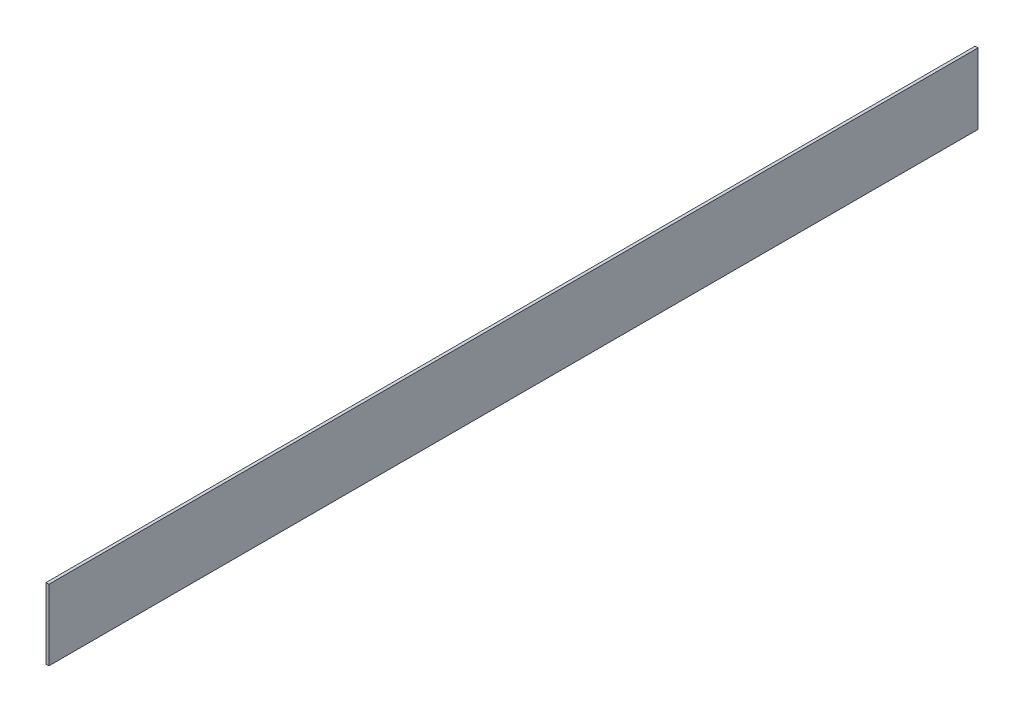
ISO-10303-21;
HEADER;
FILE_DESCRIPTION(('STEP AP214'),'2;1');
FILE_NAME('part.step','',(''),(''),'','','');
FILE_SCHEMA(('AUTOMOTIVE_DESIGN { 1 0 10303 214 1 1 1 1 }'));
ENDSEC;
DATA;
#1=APPLICATION_CONTEXT('core data for automotive mechanical design processes');
#2=APPLICATION_PROTOCOL_DEFINITION('international standard','automotive_design',2000,#1);
#3=PRODUCT_CONTEXT('',#1,'mechanical');
#4=PRODUCT('Part','Part','',(#3));
#5=PRODUCT_RELATED_PRODUCT_CATEGORY('part','',(#4));
#6=PRODUCT_DEFINITION_FORMATION('','',#4);
#7=PRODUCT_DEFINITION_CONTEXT('part definition',#1,'design');
#8=PRODUCT_DEFINITION('design','',#6,#7);
#9=PRODUCT_DEFINITION_SHAPE('','',#8);
#10=(LENGTH_UNIT() NAMED_UNIT(*) SI_UNIT(.MILLI.,.METRE.));
#11=(NAMED_UNIT(*) PLANE_ANGLE_UNIT() SI_UNIT($,.RADIAN.));
#12=(NAMED_UNIT(*) SI_UNIT($,.STERADIAN.) SOLID_ANGLE_UNIT());
#13=UNCERTAINTY_MEASURE_WITH_UNIT(LENGTH_MEASURE(1.E-05),#10,'distance_accuracy_value','');
#14=(GEOMETRIC_REPRESENTATION_CONTEXT(3) GLOBAL_UNCERTAINTY_ASSIGNED_CONTEXT((#13)) GLOBAL_UNIT_ASSIGNED_CONTEXT((#10,
#11,#12)) REPRESENTATION_CONTEXT('',''));
#15=CARTESIAN_POINT('',(0.,0.,0.));
#16=DIRECTION('',(0.,0.,1.));
#17=DIRECTION('',(1.,0.,0.));
#18=AXIS2_PLACEMENT_3D('',#15,#16,#17);
#19=CARTESIAN_POINT('',(3.175,0.,0.));
#20=DIRECTION('',(0.,0.,-1.));
#21=DIRECTION('',(0.,1.,0.));
#22=AXIS2_PLACEMENT_3D('',#19,#20,#21);
#23=PLANE('',#22);
#24=DIRECTION('',(0.,-1.,0.));
#25=VECTOR('',#24,1.);
#26=CARTESIAN_POINT('',(0.,0.,0.));
#27=LINE('',#26,#25);
#28=CARTESIAN_POINT('',(0.,0.,0.));
#29=VERTEX_POINT('',#28);
#30=CARTESIAN_POINT('',(0.,-76.073,0.));
#31=VERTEX_POINT('',#30);
#32=EDGE_CURVE('E96',#29,#31,#27,.T.);
#33=ORIENTED_EDGE('',*,*,#32,.T.);
#34=DIRECTION('',(-1.,0.,0.));
#35=VECTOR('',#34,1.);
#36=CARTESIAN_POINT('',(3.175,-76.073,0.));
#37=LINE('',#36,#35);
#38=CARTESIAN_POINT('',(3.175,-76.073,0.));
#39=VERTEX_POINT('',#38);
#40=EDGE_CURVE('E11',#39,#31,#37,.T.);
#41=ORIENTED_EDGE('',*,*,#40,.F.);
#42=DIRECTION('',(0.,-1.,0.));
#43=VECTOR('',#42,1.);
#44=CARTESIAN_POINT('',(3.175,0.,0.));
#45=LINE('',#44,#43);
#46=CARTESIAN_POINT('',(3.175,0.,0.));
#47=VERTEX_POINT('',#46);
#48=EDGE_CURVE('E84',#47,#39,#45,.T.);
#49=ORIENTED_EDGE('',*,*,#48,.F.);
#50=DIRECTION('',(-1.,0.,0.));
#51=VECTOR('',#50,1.);
#52=CARTESIAN_POINT('',(3.175,0.,0.));
#53=LINE('',#52,#51);
#54=EDGE_CURVE('E92',#47,#29,#53,.T.);
#55=ORIENTED_EDGE('',*,*,#54,.T.);
#56=EDGE_LOOP('',(#33,#41,#49,#55));
#57=FACE_BOUND('',#56,.T.);
#58=ADVANCED_FACE('F33',(#57),#23,.F.);
#59=CARTESIAN_POINT('',(3.175,-76.073,0.));
#60=DIRECTION('',(0.,1.,0.));
#61=DIRECTION('',(0.,0.,1.));
#62=AXIS2_PLACEMENT_3D('',#59,#60,#61);
#63=PLANE('',#62);
#64=DIRECTION('',(0.,0.,-1.));
#65=VECTOR('',#64,1.);
#66=CARTESIAN_POINT('',(0.,-76.073,0.));
#67=LINE('',#66,#65);
#68=CARTESIAN_POINT('',(0.,-76.073,-999.999999996));
#69=VERTEX_POINT('',#68);
#70=EDGE_CURVE('E88',#31,#69,#67,.T.);
#71=ORIENTED_EDGE('',*,*,#70,.T.);
#72=DIRECTION('',(-1.,0.,0.));
#73=VECTOR('',#72,1.);
#74=CARTESIAN_POINT('',(3.175,-76.073,-999.999999996));
#75=LINE('',#74,#73);
#76=CARTESIAN_POINT('',(3.175,-76.073,-999.999999996));
#77=VERTEX_POINT('',#76);
#78=EDGE_CURVE('E41',#77,#69,#75,.T.);
#79=ORIENTED_EDGE('',*,*,#78,.F.);
#80=DIRECTION('',(0.,0.,-1.));
#81=VECTOR('',#80,1.);
#82=CARTESIAN_POINT('',(3.175,-76.073,0.));
#83=LINE('',#82,#81);
#84=EDGE_CURVE('E79',#39,#77,#83,.T.);
#85=ORIENTED_EDGE('',*,*,#84,.F.);
#86=ORIENTED_EDGE('',*,*,#40,.T.);
#87=EDGE_LOOP('',(#71,#79,#85,#86));
#88=FACE_BOUND('',#87,.T.);
#89=ADVANCED_FACE('F87',(#88),#63,.F.);
#90=CARTESIAN_POINT('',(3.175,0.,-999.999999996));
#91=DIRECTION('',(0.,0.,1.));
#92=DIRECTION('',(1.,0.,0.));
#93=AXIS2_PLACEMENT_3D('',#90,#91,#92);
#94=PLANE('',#93);
#95=DIRECTION('',(0.,1.,0.));
#96=VECTOR('',#95,1.);
#97=CARTESIAN_POINT('',(0.,0.,-999.999999996));
#98=LINE('',#97,#96);
#99=CARTESIAN_POINT('',(0.,0.,-999.999999996));
#100=VERTEX_POINT('',#99);
#101=EDGE_CURVE('E66',#69,#100,#98,.T.);
#102=ORIENTED_EDGE('',*,*,#101,.T.);
#103=DIRECTION('',(-1.,0.,0.));
#104=VECTOR('',#103,1.);
#105=CARTESIAN_POINT('',(3.175,0.,-999.999999996));
#106=LINE('',#105,#104);
#107=CARTESIAN_POINT('',(3.175,0.,-999.999999996));
#108=VERTEX_POINT('',#107);
#109=EDGE_CURVE('E89',#108,#100,#106,.T.);
#110=ORIENTED_EDGE('',*,*,#109,.F.);
#111=DIRECTION('',(0.,1.,0.));
#112=VECTOR('',#111,1.);
#113=CARTESIAN_POINT('',(3.175,0.,-999.999999996));
#114=LINE('',#113,#112);
#115=EDGE_CURVE('E82',#77,#108,#114,.T.);
#116=ORIENTED_EDGE('',*,*,#115,.F.);
#117=ORIENTED_EDGE('',*,*,#78,.T.);
#118=EDGE_LOOP('',(#102,#110,#116,#117));
#119=FACE_BOUND('',#118,.T.);
#120=ADVANCED_FACE('F90',(#119),#94,.F.);
#121=CARTESIAN_POINT('',(3.175,0.,0.));
#122=DIRECTION('',(0.,-1.,0.));
#123=DIRECTION('',(0.,0.,-1.));
#124=AXIS2_PLACEMENT_3D('',#121,#122,#123);
#125=PLANE('',#124);
#126=DIRECTION('',(0.,0.,1.));
#127=VECTOR('',#126,1.);
#128=CARTESIAN_POINT('',(0.,0.,0.));
#129=LINE('',#128,#127);
#130=EDGE_CURVE('E72',#100,#29,#129,.T.);
#131=ORIENTED_EDGE('',*,*,#130,.T.);
#132=ORIENTED_EDGE('',*,*,#54,.F.);
#133=DIRECTION('',(0.,0.,1.));
#134=VECTOR('',#133,1.);
#135=CARTESIAN_POINT('',(3.175,0.,0.));
#136=LINE('',#135,#134);
#137=EDGE_CURVE('E49',#108,#47,#136,.T.);
#138=ORIENTED_EDGE('',*,*,#137,.F.);
#139=ORIENTED_EDGE('',*,*,#109,.T.);
#140=EDGE_LOOP('',(#131,#132,#138,#139));
#141=FACE_BOUND('',#140,.T.);
#142=ADVANCED_FACE('F103',(#141),#125,.F.);
#143=CARTESIAN_POINT('',(3.175,0.,0.));
#144=DIRECTION('',(1.,0.,0.));
#145=DIRECTION('',(0.,0.,-1.));
#146=AXIS2_PLACEMENT_3D('',#143,#144,#145);
#147=PLANE('',#146);
#148=ORIENTED_EDGE('',*,*,#48,.T.);
#149=ORIENTED_EDGE('',*,*,#84,.T.);
#150=ORIENTED_EDGE('',*,*,#115,.T.);
#151=ORIENTED_EDGE('',*,*,#137,.T.);
#152=EDGE_LOOP('',(#148,#149,#150,#151));
#153=FACE_BOUND('',#152,.T.);
#154=ADVANCED_FACE('F80',(#153),#147,.T.);
#155=CARTESIAN_POINT('',(0.,0.,0.));
#156=DIRECTION('',(1.,0.,0.));
#157=DIRECTION('',(0.,0.,-1.));
#158=AXIS2_PLACEMENT_3D('',#155,#156,#157);
#159=PLANE('',#158);
#160=ORIENTED_EDGE('',*,*,#32,.F.);
#161=ORIENTED_EDGE('',*,*,#130,.F.);
#162=ORIENTED_EDGE('',*,*,#101,.F.);
#163=ORIENTED_EDGE('',*,*,#70,.F.);
#164=EDGE_LOOP('',(#160,#161,#162,#163));
#165=FACE_BOUND('',#164,.T.);
#166=ADVANCED_FACE('F106',(#165),#159,.F.);
#167=CLOSED_SHELL('',(#58,#89,#120,#142,#154,#166));
#168=MANIFOLD_SOLID_BREP('B2',#167);
#169=ADVANCED_BREP_SHAPE_REPRESENTATION('',(#18,#168),#14);
#170=SHAPE_DEFINITION_REPRESENTATION(#9,#169);
ENDSEC;
END-ISO-10303-21;
